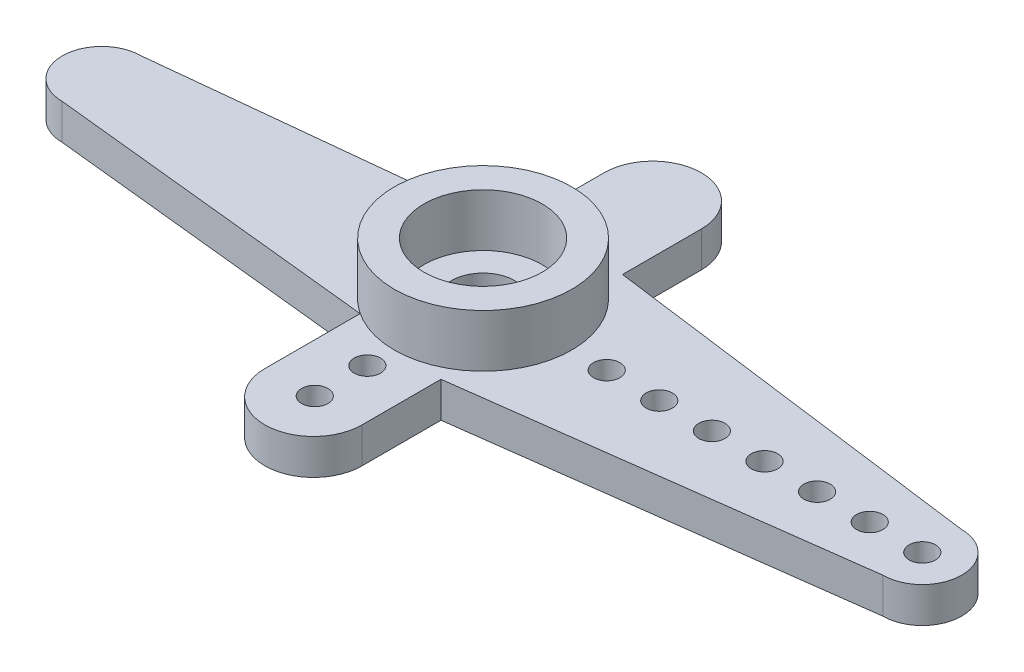
ISO-10303-21;
HEADER;
FILE_DESCRIPTION(('STEP AP214'),'2;1');
FILE_NAME('part.step','',(''),(''),'','','');
FILE_SCHEMA(('AUTOMOTIVE_DESIGN { 1 0 10303 214 1 1 1 1 }'));
ENDSEC;
DATA;
#1=APPLICATION_CONTEXT('core data for automotive mechanical design processes');
#2=APPLICATION_PROTOCOL_DEFINITION('international standard','automotive_design',2000,#1);
#3=PRODUCT_CONTEXT('',#1,'mechanical');
#4=PRODUCT('Part','Part','',(#3));
#5=PRODUCT_RELATED_PRODUCT_CATEGORY('part','',(#4));
#6=PRODUCT_DEFINITION_FORMATION('','',#4);
#7=PRODUCT_DEFINITION_CONTEXT('part definition',#1,'design');
#8=PRODUCT_DEFINITION('design','',#6,#7);
#9=PRODUCT_DEFINITION_SHAPE('','',#8);
#10=(LENGTH_UNIT() NAMED_UNIT(*) SI_UNIT(.MILLI.,.METRE.));
#11=(NAMED_UNIT(*) PLANE_ANGLE_UNIT() SI_UNIT($,.RADIAN.));
#12=(NAMED_UNIT(*) SI_UNIT($,.STERADIAN.) SOLID_ANGLE_UNIT());
#13=UNCERTAINTY_MEASURE_WITH_UNIT(LENGTH_MEASURE(1.E-05),#10,'distance_accuracy_value','');
#14=(GEOMETRIC_REPRESENTATION_CONTEXT(3) GLOBAL_UNCERTAINTY_ASSIGNED_CONTEXT((#13)) GLOBAL_UNIT_ASSIGNED_CONTEXT((#10,
#11,#12)) REPRESENTATION_CONTEXT('',''));
#15=CARTESIAN_POINT('',(0.,0.,0.));
#16=DIRECTION('',(0.,0.,1.));
#17=DIRECTION('',(1.,0.,0.));
#18=AXIS2_PLACEMENT_3D('',#15,#16,#17);
#19=CARTESIAN_POINT('',(-0.312640586171714,1.35,-2.98563064108722));
#20=DIRECTION('',(0.10414565677559,0.,0.994562055467018));
#21=DIRECTION('',(0.994562055467019,0.,-0.10414565677559));
#22=AXIS2_PLACEMENT_3D('',#19,#20,#21);
#23=PLANE('',#22);
#24=DIRECTION('',(-0.994562055467019,0.,0.10414565677559));
#25=VECTOR('',#24,1.);
#26=CARTESIAN_POINT('',(-0.312640586171714,0.,-2.98563064108722));
#27=LINE('',#26,#25);
#28=CARTESIAN_POINT('',(-1.85,0.,-2.82464590919123));
#29=VERTEX_POINT('',#28);
#30=CARTESIAN_POINT('',(-14.5,0.,-1.5));
#31=VERTEX_POINT('',#30);
#32=EDGE_CURVE('E301',#29,#31,#27,.T.);
#33=ORIENTED_EDGE('',*,*,#32,.T.);
#34=DIRECTION('',(0.,-1.,0.));
#35=VECTOR('',#34,1.);
#36=CARTESIAN_POINT('',(-14.5,1.35,-1.5));
#37=LINE('',#36,#35);
#38=CARTESIAN_POINT('',(-14.5,1.35,-1.5));
#39=VERTEX_POINT('',#38);
#40=EDGE_CURVE('E12',#39,#31,#37,.T.);
#41=ORIENTED_EDGE('',*,*,#40,.F.);
#42=DIRECTION('',(-0.994562055467019,0.,0.10414565677559));
#43=VECTOR('',#42,1.);
#44=CARTESIAN_POINT('',(-0.312640586171714,1.35,-2.98563064108722));
#45=LINE('',#44,#43);
#46=CARTESIAN_POINT('',(-1.85,1.35,-2.82464590919123));
#47=VERTEX_POINT('',#46);
#48=EDGE_CURVE('E317',#47,#39,#45,.T.);
#49=ORIENTED_EDGE('',*,*,#48,.F.);
#50=DIRECTION('',(0.,-1.,0.));
#51=VECTOR('',#50,1.);
#52=CARTESIAN_POINT('',(-1.85,1.35,-2.82464590919123));
#53=LINE('',#52,#51);
#54=EDGE_CURVE('E189',#47,#29,#53,.T.);
#55=ORIENTED_EDGE('',*,*,#54,.T.);
#56=EDGE_LOOP('',(#33,#41,#49,#55));
#57=FACE_BOUND('',#56,.T.);
#58=ADVANCED_FACE('F170',(#57),#23,.F.);
#59=CARTESIAN_POINT('',(-14.5,1.35,0.));
#60=DIRECTION('',(0.,-1.,0.));
#61=DIRECTION('',(0.,0.,-1.));
#62=AXIS2_PLACEMENT_3D('',#59,#60,#61);
#63=CYLINDRICAL_SURFACE('',#62,1.5);
#64=CARTESIAN_POINT('',(-14.5,0.,0.));
#65=DIRECTION('',(0.,1.,0.));
#66=DIRECTION('',(0.,0.,1.));
#67=AXIS2_PLACEMENT_3D('',#64,#65,#66);
#68=CIRCLE('',#67,1.5);
#69=CARTESIAN_POINT('',(-14.5,0.,1.5));
#70=VERTEX_POINT('',#69);
#71=EDGE_CURVE('E304',#31,#70,#68,.T.);
#72=ORIENTED_EDGE('',*,*,#71,.T.);
#73=DIRECTION('',(0.,-1.,0.));
#74=VECTOR('',#73,1.);
#75=CARTESIAN_POINT('',(-14.5,1.35,1.5));
#76=LINE('',#75,#74);
#77=CARTESIAN_POINT('',(-14.5,1.35,1.5));
#78=VERTEX_POINT('',#77);
#79=EDGE_CURVE('E180',#78,#70,#76,.T.);
#80=ORIENTED_EDGE('',*,*,#79,.F.);
#81=CARTESIAN_POINT('',(-14.5,1.35,0.));
#82=DIRECTION('',(0.,1.,0.));
#83=DIRECTION('',(0.,0.,1.));
#84=AXIS2_PLACEMENT_3D('',#81,#82,#83);
#85=CIRCLE('',#84,1.5);
#86=EDGE_CURVE('E382',#39,#78,#85,.T.);
#87=ORIENTED_EDGE('',*,*,#86,.F.);
#88=ORIENTED_EDGE('',*,*,#40,.T.);
#89=EDGE_LOOP('',(#72,#80,#87,#88));
#90=FACE_BOUND('',#89,.T.);
#91=ADVANCED_FACE('F380',(#90),#63,.T.);
#92=CARTESIAN_POINT('',(-0.312640586171714,1.35,2.98563064108722));
#93=DIRECTION('',(-0.10414565677559,0.,0.994562055467018));
#94=DIRECTION('',(0.994562055467019,0.,0.10414565677559));
#95=AXIS2_PLACEMENT_3D('',#92,#93,#94);
#96=PLANE('',#95);
#97=DIRECTION('',(-0.994562055467019,0.,-0.10414565677559));
#98=VECTOR('',#97,1.);
#99=CARTESIAN_POINT('',(-0.312640586171714,0.,2.98563064108722));
#100=LINE('',#99,#98);
#101=CARTESIAN_POINT('',(-1.85,0.,2.82464590919123));
#102=VERTEX_POINT('',#101);
#103=EDGE_CURVE('E309',#102,#70,#100,.T.);
#104=ORIENTED_EDGE('',*,*,#103,.F.);
#105=DIRECTION('',(0.,-1.,0.));
#106=VECTOR('',#105,1.);
#107=CARTESIAN_POINT('',(-1.85,1.35,2.82464590919123));
#108=LINE('',#107,#106);
#109=CARTESIAN_POINT('',(-1.85,1.35,2.82464590919123));
#110=VERTEX_POINT('',#109);
#111=EDGE_CURVE('E319',#110,#102,#108,.T.);
#112=ORIENTED_EDGE('',*,*,#111,.F.);
#113=DIRECTION('',(-0.994562055467019,0.,-0.10414565677559));
#114=VECTOR('',#113,1.);
#115=CARTESIAN_POINT('',(-0.312640586171714,1.35,2.98563064108722));
#116=LINE('',#115,#114);
#117=EDGE_CURVE('E312',#110,#78,#116,.T.);
#118=ORIENTED_EDGE('',*,*,#117,.T.);
#119=ORIENTED_EDGE('',*,*,#79,.T.);
#120=EDGE_LOOP('',(#104,#112,#118,#119));
#121=FACE_BOUND('',#120,.T.);
#122=ADVANCED_FACE('F376',(#121),#96,.T.);
#123=CARTESIAN_POINT('',(0.,1.35,0.));
#124=DIRECTION('',(0.,1.,0.));
#125=DIRECTION('',(0.,0.,1.));
#126=AXIS2_PLACEMENT_3D('',#123,#124,#125);
#127=PLANE('',#126);
#128=CARTESIAN_POINT('',(8.7,1.35,0.));
#129=DIRECTION('',(0.,1.,0.));
#130=DIRECTION('',(0.,0.,1.));
#131=AXIS2_PLACEMENT_3D('',#128,#129,#130);
#132=CIRCLE('',#131,0.500000000000001);
#133=CARTESIAN_POINT('',(8.7,1.35,0.500000000000001));
#134=VERTEX_POINT('',#133);
#135=EDGE_CURVE('E403',#134,#134,#132,.T.);
#136=ORIENTED_EDGE('',*,*,#135,.F.);
#137=EDGE_LOOP('',(#136));
#138=FACE_BOUND('',#137,.T.);
#139=CARTESIAN_POINT('',(10.7,1.35,0.));
#140=DIRECTION('',(0.,1.,0.));
#141=DIRECTION('',(0.,0.,1.));
#142=AXIS2_PLACEMENT_3D('',#139,#140,#141);
#143=CIRCLE('',#142,0.500000000000001);
#144=CARTESIAN_POINT('',(10.7,1.35,0.500000000000001));
#145=VERTEX_POINT('',#144);
#146=EDGE_CURVE('E408',#145,#145,#143,.T.);
#147=ORIENTED_EDGE('',*,*,#146,.F.);
#148=EDGE_LOOP('',(#147));
#149=FACE_BOUND('',#148,.T.);
#150=CARTESIAN_POINT('',(12.7,1.35,0.));
#151=DIRECTION('',(0.,1.,0.));
#152=DIRECTION('',(0.,0.,1.));
#153=AXIS2_PLACEMENT_3D('',#150,#151,#152);
#154=CIRCLE('',#153,0.500000000000001);
#155=CARTESIAN_POINT('',(12.7,1.35,0.500000000000001));
#156=VERTEX_POINT('',#155);
#157=EDGE_CURVE('E411',#156,#156,#154,.T.);
#158=ORIENTED_EDGE('',*,*,#157,.F.);
#159=EDGE_LOOP('',(#158));
#160=FACE_BOUND('',#159,.T.);
#161=CARTESIAN_POINT('',(14.7,1.35,0.));
#162=DIRECTION('',(0.,1.,0.));
#163=DIRECTION('',(0.,0.,1.));
#164=AXIS2_PLACEMENT_3D('',#161,#162,#163);
#165=CIRCLE('',#164,0.499999999999999);
#166=CARTESIAN_POINT('',(14.7,1.35,0.499999999999999));
#167=VERTEX_POINT('',#166);
#168=EDGE_CURVE('E414',#167,#167,#165,.T.);
#169=ORIENTED_EDGE('',*,*,#168,.F.);
#170=EDGE_LOOP('',(#169));
#171=FACE_BOUND('',#170,.T.);
#172=CARTESIAN_POINT('',(16.7,1.35,0.));
#173=DIRECTION('',(0.,1.,0.));
#174=DIRECTION('',(0.,0.,1.));
#175=AXIS2_PLACEMENT_3D('',#172,#173,#174);
#176=CIRCLE('',#175,0.499999999999999);
#177=CARTESIAN_POINT('',(16.7,1.35,0.499999999999999));
#178=VERTEX_POINT('',#177);
#179=EDGE_CURVE('E417',#178,#178,#176,.T.);
#180=ORIENTED_EDGE('',*,*,#179,.F.);
#181=EDGE_LOOP('',(#180));
#182=FACE_BOUND('',#181,.T.);
#183=CARTESIAN_POINT('',(6.7,1.35,0.));
#184=DIRECTION('',(0.,1.,0.));
#185=DIRECTION('',(0.,0.,1.));
#186=AXIS2_PLACEMENT_3D('',#183,#184,#185);
#187=CIRCLE('',#186,0.500000000000001);
#188=CARTESIAN_POINT('',(6.7,1.35,0.500000000000001));
#189=VERTEX_POINT('',#188);
#190=EDGE_CURVE('E420',#189,#189,#187,.T.);
#191=ORIENTED_EDGE('',*,*,#190,.F.);
#192=EDGE_LOOP('',(#191));
#193=FACE_BOUND('',#192,.T.);
#194=CARTESIAN_POINT('',(0.,1.35,6.4));
#195=DIRECTION('',(0.,1.,0.));
#196=DIRECTION('',(0.,0.,1.));
#197=AXIS2_PLACEMENT_3D('',#194,#195,#196);
#198=CIRCLE('',#197,0.5);
#199=CARTESIAN_POINT('',(0.,1.35,6.9));
#200=VERTEX_POINT('',#199);
#201=EDGE_CURVE('E423',#200,#200,#198,.T.);
#202=ORIENTED_EDGE('',*,*,#201,.F.);
#203=EDGE_LOOP('',(#202));
#204=FACE_BOUND('',#203,.T.);
#205=CARTESIAN_POINT('',(0.,1.35,4.4));
#206=DIRECTION('',(0.,1.,0.));
#207=DIRECTION('',(0.,0.,1.));
#208=AXIS2_PLACEMENT_3D('',#205,#206,#207);
#209=CIRCLE('',#208,0.5);
#210=CARTESIAN_POINT('',(0.,1.35,4.9));
#211=VERTEX_POINT('',#210);
#212=EDGE_CURVE('E426',#211,#211,#209,.T.);
#213=ORIENTED_EDGE('',*,*,#212,.F.);
#214=EDGE_LOOP('',(#213));
#215=FACE_BOUND('',#214,.T.);
#216=CARTESIAN_POINT('',(4.7,1.35,0.));
#217=DIRECTION('',(0.,1.,0.));
#218=DIRECTION('',(0.,0.,1.));
#219=AXIS2_PLACEMENT_3D('',#216,#217,#218);
#220=CIRCLE('',#219,0.500000000000002);
#221=CARTESIAN_POINT('',(4.7,1.35,0.500000000000002));
#222=VERTEX_POINT('',#221);
#223=EDGE_CURVE('E429',#222,#222,#220,.T.);
#224=ORIENTED_EDGE('',*,*,#223,.F.);
#225=EDGE_LOOP('',(#224));
#226=FACE_BOUND('',#225,.T.);
#227=CARTESIAN_POINT('',(0.,1.35,0.));
#228=DIRECTION('',(0.,1.,0.));
#229=DIRECTION('',(0.,0.,1.));
#230=AXIS2_PLACEMENT_3D('',#227,#228,#229);
#231=CIRCLE('',#230,3.375);
#232=CARTESIAN_POINT('',(0.,1.35,3.375));
#233=VERTEX_POINT('',#232);
#234=EDGE_CURVE('E388',#233,#233,#231,.T.);
#235=ORIENTED_EDGE('',*,*,#234,.F.);
#236=EDGE_LOOP('',(#235));
#237=FACE_BOUND('',#236,.T.);
#238=DIRECTION('',(0.,0.,-1.));
#239=VECTOR('',#238,1.);
#240=CARTESIAN_POINT('',(-1.85,1.35,0.));
#241=LINE('',#240,#239);
#242=CARTESIAN_POINT('',(-1.85,1.35,-6.45));
#243=VERTEX_POINT('',#242);
#244=EDGE_CURVE('E323',#47,#243,#241,.T.);
#245=ORIENTED_EDGE('',*,*,#244,.F.);
#246=ORIENTED_EDGE('',*,*,#48,.T.);
#247=ORIENTED_EDGE('',*,*,#86,.T.);
#248=ORIENTED_EDGE('',*,*,#117,.F.);
#249=DIRECTION('',(0.,0.,-1.));
#250=VECTOR('',#249,1.);
#251=CARTESIAN_POINT('',(-1.85,1.35,0.));
#252=LINE('',#251,#250);
#253=CARTESIAN_POINT('',(-1.85,1.35,6.45));
#254=VERTEX_POINT('',#253);
#255=EDGE_CURVE('E325',#254,#110,#252,.T.);
#256=ORIENTED_EDGE('',*,*,#255,.F.);
#257=CARTESIAN_POINT('',(0.,1.35,6.45));
#258=DIRECTION('',(0.,1.,0.));
#259=DIRECTION('',(0.,0.,1.));
#260=AXIS2_PLACEMENT_3D('',#257,#258,#259);
#261=CIRCLE('',#260,1.85);
#262=CARTESIAN_POINT('',(1.85,1.35,6.45));
#263=VERTEX_POINT('',#262);
#264=EDGE_CURVE('E328',#254,#263,#261,.T.);
#265=ORIENTED_EDGE('',*,*,#264,.T.);
#266=DIRECTION('',(0.,0.,-1.));
#267=VECTOR('',#266,1.);
#268=CARTESIAN_POINT('',(1.85,1.35,0.));
#269=LINE('',#268,#267);
#270=CARTESIAN_POINT('',(1.85,1.35,3.45));
#271=VERTEX_POINT('',#270);
#272=EDGE_CURVE('E330',#263,#271,#269,.T.);
#273=ORIENTED_EDGE('',*,*,#272,.T.);
#274=DIRECTION('',(0.991488349625111,0.,-0.130195439849762));
#275=VECTOR('',#274,1.);
#276=CARTESIAN_POINT('',(0.476710130391174,1.35,3.63033099297894));
#277=LINE('',#276,#275);
#278=CARTESIAN_POINT('',(16.7,1.35,1.5));
#279=VERTEX_POINT('',#278);
#280=EDGE_CURVE('E333',#271,#279,#277,.T.);
#281=ORIENTED_EDGE('',*,*,#280,.T.);
#282=CARTESIAN_POINT('',(16.7,1.35,0.));
#283=DIRECTION('',(0.,1.,0.));
#284=DIRECTION('',(0.,0.,1.));
#285=AXIS2_PLACEMENT_3D('',#282,#283,#284);
#286=CIRCLE('',#285,1.5);
#287=CARTESIAN_POINT('',(16.7,1.35,-1.5));
#288=VERTEX_POINT('',#287);
#289=EDGE_CURVE('E335',#288,#279,#286,.F.);
#290=ORIENTED_EDGE('',*,*,#289,.F.);
#291=DIRECTION('',(0.991488349625111,0.,0.130195439849762));
#292=VECTOR('',#291,1.);
#293=CARTESIAN_POINT('',(0.476710130391174,1.35,-3.63033099297894));
#294=LINE('',#293,#292);
#295=CARTESIAN_POINT('',(1.85,1.35,-3.45));
#296=VERTEX_POINT('',#295);
#297=EDGE_CURVE('E267',#296,#288,#294,.T.);
#298=ORIENTED_EDGE('',*,*,#297,.F.);
#299=DIRECTION('',(0.,0.,-1.));
#300=VECTOR('',#299,1.);
#301=CARTESIAN_POINT('',(1.85,1.35,0.));
#302=LINE('',#301,#300);
#303=CARTESIAN_POINT('',(1.85,1.35,-6.45));
#304=VERTEX_POINT('',#303);
#305=EDGE_CURVE('E265',#296,#304,#302,.T.);
#306=ORIENTED_EDGE('',*,*,#305,.T.);
#307=CARTESIAN_POINT('',(0.,1.35,-6.45));
#308=DIRECTION('',(0.,1.,0.));
#309=DIRECTION('',(0.,0.,1.));
#310=AXIS2_PLACEMENT_3D('',#307,#308,#309);
#311=CIRCLE('',#310,1.85);
#312=EDGE_CURVE('E284',#304,#243,#311,.T.);
#313=ORIENTED_EDGE('',*,*,#312,.T.);
#314=EDGE_LOOP('',(#245,#246,#247,#248,#256,#265,#273,#281,#290,#298,#306,#313));
#315=FACE_BOUND('',#314,.T.);
#316=ADVANCED_FACE('F360',(#138,#149,#160,#171,#182,#193,#204,#215,#226,#237,#315),#127,.T.);
#317=CARTESIAN_POINT('',(0.,0.,0.));
#318=DIRECTION('',(0.,1.,0.));
#319=DIRECTION('',(0.,0.,1.));
#320=AXIS2_PLACEMENT_3D('',#317,#318,#319);
#321=PLANE('',#320);
#322=CARTESIAN_POINT('',(8.7,0.,0.));
#323=DIRECTION('',(0.,-1.,0.));
#324=DIRECTION('',(0.,0.,-1.));
#325=AXIS2_PLACEMENT_3D('',#322,#323,#324);
#326=CIRCLE('',#325,0.500000000000001);
#327=CARTESIAN_POINT('',(8.7,0.,-0.500000000000001));
#328=VERTEX_POINT('',#327);
#329=EDGE_CURVE('E435',#328,#328,#326,.T.);
#330=ORIENTED_EDGE('',*,*,#329,.F.);
#331=EDGE_LOOP('',(#330));
#332=FACE_BOUND('',#331,.T.);
#333=CARTESIAN_POINT('',(10.7,0.,0.));
#334=DIRECTION('',(0.,-1.,0.));
#335=DIRECTION('',(0.,0.,-1.));
#336=AXIS2_PLACEMENT_3D('',#333,#334,#335);
#337=CIRCLE('',#336,0.500000000000001);
#338=CARTESIAN_POINT('',(10.7,0.,-0.500000000000001));
#339=VERTEX_POINT('',#338);
#340=EDGE_CURVE('E443',#339,#339,#337,.T.);
#341=ORIENTED_EDGE('',*,*,#340,.F.);
#342=EDGE_LOOP('',(#341));
#343=FACE_BOUND('',#342,.T.);
#344=CARTESIAN_POINT('',(12.7,0.,0.));
#345=DIRECTION('',(0.,-1.,0.));
#346=DIRECTION('',(0.,0.,-1.));
#347=AXIS2_PLACEMENT_3D('',#344,#345,#346);
#348=CIRCLE('',#347,0.500000000000001);
#349=CARTESIAN_POINT('',(12.7,0.,-0.500000000000001));
#350=VERTEX_POINT('',#349);
#351=EDGE_CURVE('E439',#350,#350,#348,.T.);
#352=ORIENTED_EDGE('',*,*,#351,.F.);
#353=EDGE_LOOP('',(#352));
#354=FACE_BOUND('',#353,.T.);
#355=CARTESIAN_POINT('',(14.7,0.,0.));
#356=DIRECTION('',(0.,-1.,0.));
#357=DIRECTION('',(0.,0.,-1.));
#358=AXIS2_PLACEMENT_3D('',#355,#356,#357);
#359=CIRCLE('',#358,0.499999999999999);
#360=CARTESIAN_POINT('',(14.7,0.,-0.499999999999999));
#361=VERTEX_POINT('',#360);
#362=EDGE_CURVE('E436',#361,#361,#359,.T.);
#363=ORIENTED_EDGE('',*,*,#362,.F.);
#364=EDGE_LOOP('',(#363));
#365=FACE_BOUND('',#364,.T.);
#366=CARTESIAN_POINT('',(16.7,0.,0.));
#367=DIRECTION('',(0.,-1.,0.));
#368=DIRECTION('',(0.,0.,-1.));
#369=AXIS2_PLACEMENT_3D('',#366,#367,#368);
#370=CIRCLE('',#369,0.499999999999999);
#371=CARTESIAN_POINT('',(16.7,0.,-0.499999999999999));
#372=VERTEX_POINT('',#371);
#373=EDGE_CURVE('E440',#372,#372,#370,.T.);
#374=ORIENTED_EDGE('',*,*,#373,.F.);
#375=EDGE_LOOP('',(#374));
#376=FACE_BOUND('',#375,.T.);
#377=CARTESIAN_POINT('',(6.7,0.,0.));
#378=DIRECTION('',(0.,-1.,0.));
#379=DIRECTION('',(0.,0.,-1.));
#380=AXIS2_PLACEMENT_3D('',#377,#378,#379);
#381=CIRCLE('',#380,0.500000000000001);
#382=CARTESIAN_POINT('',(6.7,0.,-0.500000000000001));
#383=VERTEX_POINT('',#382);
#384=EDGE_CURVE('E454',#383,#383,#381,.T.);
#385=ORIENTED_EDGE('',*,*,#384,.F.);
#386=EDGE_LOOP('',(#385));
#387=FACE_BOUND('',#386,.T.);
#388=CARTESIAN_POINT('',(0.,0.,6.4));
#389=DIRECTION('',(0.,-1.,0.));
#390=DIRECTION('',(0.,0.,-1.));
#391=AXIS2_PLACEMENT_3D('',#388,#389,#390);
#392=CIRCLE('',#391,0.5);
#393=CARTESIAN_POINT('',(0.,0.,5.9));
#394=VERTEX_POINT('',#393);
#395=EDGE_CURVE('E451',#394,#394,#392,.T.);
#396=ORIENTED_EDGE('',*,*,#395,.F.);
#397=EDGE_LOOP('',(#396));
#398=FACE_BOUND('',#397,.T.);
#399=CARTESIAN_POINT('',(0.,0.,4.4));
#400=DIRECTION('',(0.,-1.,0.));
#401=DIRECTION('',(0.,0.,-1.));
#402=AXIS2_PLACEMENT_3D('',#399,#400,#401);
#403=CIRCLE('',#402,0.5);
#404=CARTESIAN_POINT('',(0.,0.,3.9));
#405=VERTEX_POINT('',#404);
#406=EDGE_CURVE('E448',#405,#405,#403,.T.);
#407=ORIENTED_EDGE('',*,*,#406,.F.);
#408=EDGE_LOOP('',(#407));
#409=FACE_BOUND('',#408,.T.);
#410=CARTESIAN_POINT('',(4.7,0.,0.));
#411=DIRECTION('',(0.,-1.,0.));
#412=DIRECTION('',(0.,0.,-1.));
#413=AXIS2_PLACEMENT_3D('',#410,#411,#412);
#414=CIRCLE('',#413,0.500000000000002);
#415=CARTESIAN_POINT('',(4.7,0.,-0.500000000000002));
#416=VERTEX_POINT('',#415);
#417=EDGE_CURVE('E432',#416,#416,#414,.T.);
#418=ORIENTED_EDGE('',*,*,#417,.F.);
#419=EDGE_LOOP('',(#418));
#420=FACE_BOUND('',#419,.T.);
#421=CARTESIAN_POINT('',(0.,0.,0.));
#422=DIRECTION('',(0.,1.,0.));
#423=DIRECTION('',(0.,0.,1.));
#424=AXIS2_PLACEMENT_3D('',#421,#422,#423);
#425=CIRCLE('',#424,1.2);
#426=CARTESIAN_POINT('',(0.,0.,1.2));
#427=VERTEX_POINT('',#426);
#428=EDGE_CURVE('E397',#427,#427,#425,.T.);
#429=ORIENTED_EDGE('',*,*,#428,.T.);
#430=EDGE_LOOP('',(#429));
#431=FACE_BOUND('',#430,.T.);
#432=ORIENTED_EDGE('',*,*,#32,.F.);
#433=DIRECTION('',(0.,0.,-1.));
#434=VECTOR('',#433,1.);
#435=CARTESIAN_POINT('',(-1.85,0.,0.));
#436=LINE('',#435,#434);
#437=CARTESIAN_POINT('',(-1.85,0.,-6.45));
#438=VERTEX_POINT('',#437);
#439=EDGE_CURVE('E340',#29,#438,#436,.T.);
#440=ORIENTED_EDGE('',*,*,#439,.T.);
#441=CARTESIAN_POINT('',(0.,0.,-6.45));
#442=DIRECTION('',(0.,1.,0.));
#443=DIRECTION('',(0.,0.,1.));
#444=AXIS2_PLACEMENT_3D('',#441,#442,#443);
#445=CIRCLE('',#444,1.85);
#446=CARTESIAN_POINT('',(1.85,0.,-6.45));
#447=VERTEX_POINT('',#446);
#448=EDGE_CURVE('E277',#447,#438,#445,.T.);
#449=ORIENTED_EDGE('',*,*,#448,.F.);
#450=DIRECTION('',(0.,0.,-1.));
#451=VECTOR('',#450,1.);
#452=CARTESIAN_POINT('',(1.85,0.,0.));
#453=LINE('',#452,#451);
#454=CARTESIAN_POINT('',(1.85,0.,-3.45));
#455=VERTEX_POINT('',#454);
#456=EDGE_CURVE('E263',#455,#447,#453,.T.);
#457=ORIENTED_EDGE('',*,*,#456,.F.);
#458=DIRECTION('',(0.991488349625111,0.,0.130195439849762));
#459=VECTOR('',#458,1.);
#460=CARTESIAN_POINT('',(0.476710130391174,0.,-3.63033099297894));
#461=LINE('',#460,#459);
#462=CARTESIAN_POINT('',(16.7,0.,-1.5));
#463=VERTEX_POINT('',#462);
#464=EDGE_CURVE('E274',#455,#463,#461,.T.);
#465=ORIENTED_EDGE('',*,*,#464,.T.);
#466=CARTESIAN_POINT('',(16.7,0.,0.));
#467=DIRECTION('',(0.,1.,0.));
#468=DIRECTION('',(0.,0.,1.));
#469=AXIS2_PLACEMENT_3D('',#466,#467,#468);
#470=CIRCLE('',#469,1.5);
#471=CARTESIAN_POINT('',(16.7,0.,1.5));
#472=VERTEX_POINT('',#471);
#473=EDGE_CURVE('E282',#463,#472,#470,.F.);
#474=ORIENTED_EDGE('',*,*,#473,.T.);
#475=DIRECTION('',(0.991488349625111,0.,-0.130195439849762));
#476=VECTOR('',#475,1.);
#477=CARTESIAN_POINT('',(0.476710130391174,0.,3.63033099297894));
#478=LINE('',#477,#476);
#479=CARTESIAN_POINT('',(1.85,0.,3.45));
#480=VERTEX_POINT('',#479);
#481=EDGE_CURVE('E286',#480,#472,#478,.T.);
#482=ORIENTED_EDGE('',*,*,#481,.F.);
#483=DIRECTION('',(0.,0.,-1.));
#484=VECTOR('',#483,1.);
#485=CARTESIAN_POINT('',(1.85,0.,0.));
#486=LINE('',#485,#484);
#487=CARTESIAN_POINT('',(1.85,0.,6.45));
#488=VERTEX_POINT('',#487);
#489=EDGE_CURVE('E347',#488,#480,#486,.T.);
#490=ORIENTED_EDGE('',*,*,#489,.F.);
#491=CARTESIAN_POINT('',(0.,0.,6.45));
#492=DIRECTION('',(0.,1.,0.));
#493=DIRECTION('',(0.,0.,1.));
#494=AXIS2_PLACEMENT_3D('',#491,#492,#493);
#495=CIRCLE('',#494,1.85);
#496=CARTESIAN_POINT('',(-1.85,0.,6.45));
#497=VERTEX_POINT('',#496);
#498=EDGE_CURVE('E345',#497,#488,#495,.T.);
#499=ORIENTED_EDGE('',*,*,#498,.F.);
#500=DIRECTION('',(0.,0.,-1.));
#501=VECTOR('',#500,1.);
#502=CARTESIAN_POINT('',(-1.85,0.,0.));
#503=LINE('',#502,#501);
#504=EDGE_CURVE('E342',#497,#102,#503,.T.);
#505=ORIENTED_EDGE('',*,*,#504,.T.);
#506=ORIENTED_EDGE('',*,*,#103,.T.);
#507=ORIENTED_EDGE('',*,*,#71,.F.);
#508=EDGE_LOOP('',(#432,#440,#449,#457,#465,#474,#482,#490,#499,#505,#506,#507));
#509=FACE_BOUND('',#508,.T.);
#510=ADVANCED_FACE('F272',(#332,#343,#354,#365,#376,#387,#398,#409,#420,#431,#509),#321,.F.);
#511=CARTESIAN_POINT('',(0.476710130391174,1.35,3.63033099297894));
#512=DIRECTION('',(-0.130195439849762,0.,-0.991488349625111));
#513=DIRECTION('',(-0.991488349625111,0.,0.130195439849762));
#514=AXIS2_PLACEMENT_3D('',#511,#512,#513);
#515=PLANE('',#514);
#516=ORIENTED_EDGE('',*,*,#481,.T.);
#517=DIRECTION('',(0.,-1.,0.));
#518=VECTOR('',#517,1.);
#519=CARTESIAN_POINT('',(16.7,1.35,1.5));
#520=LINE('',#519,#518);
#521=EDGE_CURVE('E291',#279,#472,#520,.T.);
#522=ORIENTED_EDGE('',*,*,#521,.F.);
#523=ORIENTED_EDGE('',*,*,#280,.F.);
#524=DIRECTION('',(0.,-1.,0.));
#525=VECTOR('',#524,1.);
#526=CARTESIAN_POINT('',(1.85,1.35,3.45));
#527=LINE('',#526,#525);
#528=EDGE_CURVE('E293',#271,#480,#527,.T.);
#529=ORIENTED_EDGE('',*,*,#528,.T.);
#530=EDGE_LOOP('',(#516,#522,#523,#529));
#531=FACE_BOUND('',#530,.T.);
#532=ADVANCED_FACE('F353',(#531),#515,.F.);
#533=CARTESIAN_POINT('',(16.7,1.35,0.));
#534=DIRECTION('',(0.,-1.,0.));
#535=DIRECTION('',(0.,0.,-1.));
#536=AXIS2_PLACEMENT_3D('',#533,#534,#535);
#537=CYLINDRICAL_SURFACE('',#536,1.5);
#538=ORIENTED_EDGE('',*,*,#473,.F.);
#539=DIRECTION('',(0.,-1.,0.));
#540=VECTOR('',#539,1.);
#541=CARTESIAN_POINT('',(16.7,1.35,-1.5));
#542=LINE('',#541,#540);
#543=EDGE_CURVE('E254',#288,#463,#542,.T.);
#544=ORIENTED_EDGE('',*,*,#543,.F.);
#545=ORIENTED_EDGE('',*,*,#289,.T.);
#546=ORIENTED_EDGE('',*,*,#521,.T.);
#547=EDGE_LOOP('',(#538,#544,#545,#546));
#548=FACE_BOUND('',#547,.T.);
#549=ADVANCED_FACE('F357',(#548),#537,.T.);
#550=CARTESIAN_POINT('',(0.476710130391174,1.35,-3.63033099297894));
#551=DIRECTION('',(0.130195439849762,0.,-0.991488349625111));
#552=DIRECTION('',(-0.991488349625111,0.,-0.130195439849762));
#553=AXIS2_PLACEMENT_3D('',#550,#551,#552);
#554=PLANE('',#553);
#555=ORIENTED_EDGE('',*,*,#464,.F.);
#556=DIRECTION('',(0.,-1.,0.));
#557=VECTOR('',#556,1.);
#558=CARTESIAN_POINT('',(1.85,1.35,-3.45));
#559=LINE('',#558,#557);
#560=EDGE_CURVE('E260',#296,#455,#559,.T.);
#561=ORIENTED_EDGE('',*,*,#560,.F.);
#562=ORIENTED_EDGE('',*,*,#297,.T.);
#563=ORIENTED_EDGE('',*,*,#543,.T.);
#564=EDGE_LOOP('',(#555,#561,#562,#563));
#565=FACE_BOUND('',#564,.T.);
#566=ADVANCED_FACE('F281',(#565),#554,.T.);
#567=CARTESIAN_POINT('',(1.85,1.35,0.));
#568=DIRECTION('',(-1.,0.,0.));
#569=DIRECTION('',(0.,0.,1.));
#570=AXIS2_PLACEMENT_3D('',#567,#568,#569);
#571=PLANE('',#570);
#572=ORIENTED_EDGE('',*,*,#456,.T.);
#573=DIRECTION('',(0.,-1.,0.));
#574=VECTOR('',#573,1.);
#575=CARTESIAN_POINT('',(1.85,1.35,-6.45));
#576=LINE('',#575,#574);
#577=EDGE_CURVE('E174',#304,#447,#576,.T.);
#578=ORIENTED_EDGE('',*,*,#577,.F.);
#579=ORIENTED_EDGE('',*,*,#305,.F.);
#580=ORIENTED_EDGE('',*,*,#560,.T.);
#581=EDGE_LOOP('',(#572,#578,#579,#580));
#582=FACE_BOUND('',#581,.T.);
#583=ADVANCED_FACE('F172',(#582),#571,.F.);
#584=CARTESIAN_POINT('',(1.85,1.35,0.));
#585=DIRECTION('',(-1.,0.,0.));
#586=DIRECTION('',(0.,0.,1.));
#587=AXIS2_PLACEMENT_3D('',#584,#585,#586);
#588=PLANE('',#587);
#589=ORIENTED_EDGE('',*,*,#489,.T.);
#590=ORIENTED_EDGE('',*,*,#528,.F.);
#591=ORIENTED_EDGE('',*,*,#272,.F.);
#592=DIRECTION('',(0.,-1.,0.));
#593=VECTOR('',#592,1.);
#594=CARTESIAN_POINT('',(1.85,1.35,6.45));
#595=LINE('',#594,#593);
#596=EDGE_CURVE('E295',#263,#488,#595,.T.);
#597=ORIENTED_EDGE('',*,*,#596,.T.);
#598=EDGE_LOOP('',(#589,#590,#591,#597));
#599=FACE_BOUND('',#598,.T.);
#600=ADVANCED_FACE('F366',(#599),#588,.F.);
#601=CARTESIAN_POINT('',(0.,1.35,-6.45));
#602=DIRECTION('',(0.,-1.,0.));
#603=DIRECTION('',(0.,0.,-1.));
#604=AXIS2_PLACEMENT_3D('',#601,#602,#603);
#605=CYLINDRICAL_SURFACE('',#604,1.85);
#606=ORIENTED_EDGE('',*,*,#448,.T.);
#607=DIRECTION('',(0.,-1.,0.));
#608=VECTOR('',#607,1.);
#609=CARTESIAN_POINT('',(-1.85,1.35,-6.45));
#610=LINE('',#609,#608);
#611=EDGE_CURVE('E299',#243,#438,#610,.T.);
#612=ORIENTED_EDGE('',*,*,#611,.F.);
#613=ORIENTED_EDGE('',*,*,#312,.F.);
#614=ORIENTED_EDGE('',*,*,#577,.T.);
#615=EDGE_LOOP('',(#606,#612,#613,#614));
#616=FACE_BOUND('',#615,.T.);
#617=ADVANCED_FACE('F519',(#616),#605,.T.);
#618=CARTESIAN_POINT('',(0.,1.35,6.45));
#619=DIRECTION('',(0.,-1.,0.));
#620=DIRECTION('',(0.,0.,-1.));
#621=AXIS2_PLACEMENT_3D('',#618,#619,#620);
#622=CYLINDRICAL_SURFACE('',#621,1.85);
#623=ORIENTED_EDGE('',*,*,#498,.T.);
#624=ORIENTED_EDGE('',*,*,#596,.F.);
#625=ORIENTED_EDGE('',*,*,#264,.F.);
#626=DIRECTION('',(0.,-1.,0.));
#627=VECTOR('',#626,1.);
#628=CARTESIAN_POINT('',(-1.85,1.35,6.45));
#629=LINE('',#628,#627);
#630=EDGE_CURVE('E298',#254,#497,#629,.T.);
#631=ORIENTED_EDGE('',*,*,#630,.T.);
#632=EDGE_LOOP('',(#623,#624,#625,#631));
#633=FACE_BOUND('',#632,.T.);
#634=ADVANCED_FACE('F523',(#633),#622,.T.);
#635=CARTESIAN_POINT('',(-1.85,1.35,0.));
#636=DIRECTION('',(-1.,0.,0.));
#637=DIRECTION('',(0.,0.,1.));
#638=AXIS2_PLACEMENT_3D('',#635,#636,#637);
#639=PLANE('',#638);
#640=ORIENTED_EDGE('',*,*,#504,.F.);
#641=ORIENTED_EDGE('',*,*,#630,.F.);
#642=ORIENTED_EDGE('',*,*,#255,.T.);
#643=ORIENTED_EDGE('',*,*,#111,.T.);
#644=EDGE_LOOP('',(#640,#641,#642,#643));
#645=FACE_BOUND('',#644,.T.);
#646=ADVANCED_FACE('F372',(#645),#639,.T.);
#647=CARTESIAN_POINT('',(-1.85,1.35,0.));
#648=DIRECTION('',(-1.,0.,0.));
#649=DIRECTION('',(0.,0.,1.));
#650=AXIS2_PLACEMENT_3D('',#647,#648,#649);
#651=PLANE('',#650);
#652=ORIENTED_EDGE('',*,*,#439,.F.);
#653=ORIENTED_EDGE('',*,*,#54,.F.);
#654=ORIENTED_EDGE('',*,*,#244,.T.);
#655=ORIENTED_EDGE('',*,*,#611,.T.);
#656=EDGE_LOOP('',(#652,#653,#654,#655));
#657=FACE_BOUND('',#656,.T.);
#658=ADVANCED_FACE('F504',(#657),#651,.T.);
#659=CARTESIAN_POINT('',(0.,3.35,0.));
#660=DIRECTION('',(0.,-1.,0.));
#661=DIRECTION('',(0.,0.,-1.));
#662=AXIS2_PLACEMENT_3D('',#659,#660,#661);
#663=CYLINDRICAL_SURFACE('',#662,3.375);
#664=CARTESIAN_POINT('',(0.,3.35,0.));
#665=DIRECTION('',(0.,1.,0.));
#666=DIRECTION('',(0.,0.,1.));
#667=AXIS2_PLACEMENT_3D('',#664,#665,#666);
#668=CIRCLE('',#667,3.375);
#669=CARTESIAN_POINT('',(0.,3.35,3.375));
#670=VERTEX_POINT('',#669);
#671=EDGE_CURVE('E279',#670,#670,#668,.T.);
#672=ORIENTED_EDGE('',*,*,#671,.F.);
#673=EDGE_LOOP('',(#672));
#674=FACE_BOUND('',#673,.T.);
#675=ORIENTED_EDGE('',*,*,#234,.T.);
#676=EDGE_LOOP('',(#675));
#677=FACE_BOUND('',#676,.T.);
#678=ADVANCED_FACE('F466',(#674,#677),#663,.T.);
#679=CARTESIAN_POINT('',(0.,3.35,0.));
#680=DIRECTION('',(0.,1.,0.));
#681=DIRECTION('',(0.,0.,1.));
#682=AXIS2_PLACEMENT_3D('',#679,#680,#681);
#683=PLANE('',#682);
#684=CARTESIAN_POINT('',(0.,3.35,0.));
#685=DIRECTION('',(0.,1.,0.));
#686=DIRECTION('',(0.,0.,1.));
#687=AXIS2_PLACEMENT_3D('',#684,#685,#686);
#688=CIRCLE('',#687,2.25);
#689=CARTESIAN_POINT('',(0.,3.35,2.25));
#690=VERTEX_POINT('',#689);
#691=EDGE_CURVE('E394',#690,#690,#688,.T.);
#692=ORIENTED_EDGE('',*,*,#691,.F.);
#693=EDGE_LOOP('',(#692));
#694=FACE_BOUND('',#693,.T.);
#695=ORIENTED_EDGE('',*,*,#671,.T.);
#696=EDGE_LOOP('',(#695));
#697=FACE_BOUND('',#696,.T.);
#698=ADVANCED_FACE('F493',(#694,#697),#683,.T.);
#699=CARTESIAN_POINT('',(0.,1.35,0.));
#700=DIRECTION('',(0.,1.,0.));
#701=DIRECTION('',(0.,0.,1.));
#702=AXIS2_PLACEMENT_3D('',#699,#700,#701);
#703=CYLINDRICAL_SURFACE('',#702,2.25);
#704=CARTESIAN_POINT('',(0.,1.35,0.));
#705=DIRECTION('',(0.,1.,0.));
#706=DIRECTION('',(0.,0.,1.));
#707=AXIS2_PLACEMENT_3D('',#704,#705,#706);
#708=CIRCLE('',#707,2.25);
#709=CARTESIAN_POINT('',(0.,1.35,2.25));
#710=VERTEX_POINT('',#709);
#711=EDGE_CURVE('E391',#710,#710,#708,.T.);
#712=ORIENTED_EDGE('',*,*,#711,.F.);
#713=EDGE_LOOP('',(#712));
#714=FACE_BOUND('',#713,.T.);
#715=ORIENTED_EDGE('',*,*,#691,.T.);
#716=EDGE_LOOP('',(#715));
#717=FACE_BOUND('',#716,.T.);
#718=ADVANCED_FACE('F487',(#714,#717),#703,.F.);
#719=CARTESIAN_POINT('',(0.,1.35,0.));
#720=DIRECTION('',(0.,1.,0.));
#721=DIRECTION('',(0.,0.,1.));
#722=AXIS2_PLACEMENT_3D('',#719,#720,#721);
#723=PLANE('',#722);
#724=CARTESIAN_POINT('',(0.,1.35,0.));
#725=DIRECTION('',(0.,1.,0.));
#726=DIRECTION('',(0.,0.,1.));
#727=AXIS2_PLACEMENT_3D('',#724,#725,#726);
#728=CIRCLE('',#727,1.2);
#729=CARTESIAN_POINT('',(0.,1.35,1.2));
#730=VERTEX_POINT('',#729);
#731=EDGE_CURVE('E400',#730,#730,#728,.T.);
#732=ORIENTED_EDGE('',*,*,#731,.F.);
#733=EDGE_LOOP('',(#732));
#734=FACE_BOUND('',#733,.T.);
#735=ORIENTED_EDGE('',*,*,#711,.T.);
#736=EDGE_LOOP('',(#735));
#737=FACE_BOUND('',#736,.T.);
#738=ADVANCED_FACE('F481',(#734,#737),#723,.T.);
#739=CARTESIAN_POINT('',(0.,0.,0.));
#740=DIRECTION('',(0.,1.,0.));
#741=DIRECTION('',(0.,0.,1.));
#742=AXIS2_PLACEMENT_3D('',#739,#740,#741);
#743=CYLINDRICAL_SURFACE('',#742,1.2);
#744=CARTESIAN_POINT('',(0.,0.,1.2));
#745=CARTESIAN_POINT('',(0.,0.0140625,1.2));
#746=CARTESIAN_POINT('',(0.,0.028125,1.2));
#747=CARTESIAN_POINT('',(0.,0.05625,1.2));
#748=CARTESIAN_POINT('',(0.,0.0703125,1.2));
#749=CARTESIAN_POINT('',(0.,0.0984375,1.2));
#750=CARTESIAN_POINT('',(0.,0.1125,1.2));
#751=CARTESIAN_POINT('',(0.,0.140625,1.2));
#752=CARTESIAN_POINT('',(0.,0.1546875,1.2));
#753=CARTESIAN_POINT('',(0.,0.1828125,1.2));
#754=CARTESIAN_POINT('',(0.,0.196875,1.2));
#755=CARTESIAN_POINT('',(0.,0.225,1.2));
#756=CARTESIAN_POINT('',(0.,0.2390625,1.2));
#757=CARTESIAN_POINT('',(0.,0.2671875,1.2));
#758=CARTESIAN_POINT('',(0.,0.28125,1.2));
#759=CARTESIAN_POINT('',(0.,0.309375,1.2));
#760=CARTESIAN_POINT('',(0.,0.3234375,1.2));
#761=CARTESIAN_POINT('',(0.,0.3515625,1.2));
#762=CARTESIAN_POINT('',(0.,0.365625,1.2));
#763=CARTESIAN_POINT('',(0.,0.39375,1.2));
#764=CARTESIAN_POINT('',(0.,0.4078125,1.2));
#765=CARTESIAN_POINT('',(0.,0.4359375,1.2));
#766=CARTESIAN_POINT('',(0.,0.45,1.2));
#767=CARTESIAN_POINT('',(0.,0.478125,1.2));
#768=CARTESIAN_POINT('',(0.,0.4921875,1.2));
#769=CARTESIAN_POINT('',(0.,0.5203125,1.2));
#770=CARTESIAN_POINT('',(0.,0.534375,1.2));
#771=CARTESIAN_POINT('',(0.,0.5625,1.2));
#772=CARTESIAN_POINT('',(0.,0.5765625,1.2));
#773=CARTESIAN_POINT('',(0.,0.6046875,1.2));
#774=CARTESIAN_POINT('',(0.,0.61875,1.2));
#775=CARTESIAN_POINT('',(0.,0.646875,1.2));
#776=CARTESIAN_POINT('',(0.,0.6609375,1.2));
#777=CARTESIAN_POINT('',(0.,0.6890625,1.2));
#778=CARTESIAN_POINT('',(0.,0.703125,1.2));
#779=CARTESIAN_POINT('',(0.,0.73125,1.2));
#780=CARTESIAN_POINT('',(0.,0.7453125,1.2));
#781=CARTESIAN_POINT('',(0.,0.7734375,1.2));
#782=CARTESIAN_POINT('',(0.,0.7875,1.2));
#783=CARTESIAN_POINT('',(0.,0.815625,1.2));
#784=CARTESIAN_POINT('',(0.,0.8296875,1.2));
#785=CARTESIAN_POINT('',(0.,0.8578125,1.2));
#786=CARTESIAN_POINT('',(0.,0.871875,1.2));
#787=CARTESIAN_POINT('',(0.,0.9,1.2));
#788=CARTESIAN_POINT('',(0.,0.9140625,1.2));
#789=CARTESIAN_POINT('',(0.,0.9421875,1.2));
#790=CARTESIAN_POINT('',(0.,0.95625,1.2));
#791=CARTESIAN_POINT('',(0.,0.984375,1.2));
#792=CARTESIAN_POINT('',(0.,0.9984375,1.2));
#793=CARTESIAN_POINT('',(0.,1.0265625,1.2));
#794=CARTESIAN_POINT('',(0.,1.040625,1.2));
#795=CARTESIAN_POINT('',(0.,1.06875,1.2));
#796=CARTESIAN_POINT('',(0.,1.0828125,1.2));
#797=CARTESIAN_POINT('',(0.,1.1109375,1.2));
#798=CARTESIAN_POINT('',(0.,1.125,1.2));
#799=CARTESIAN_POINT('',(0.,1.153125,1.2));
#800=CARTESIAN_POINT('',(0.,1.1671875,1.2));
#801=CARTESIAN_POINT('',(0.,1.1953125,1.2));
#802=CARTESIAN_POINT('',(0.,1.209375,1.2));
#803=CARTESIAN_POINT('',(0.,1.2375,1.2));
#804=CARTESIAN_POINT('',(0.,1.2515625,1.2));
#805=CARTESIAN_POINT('',(0.,1.2796875,1.2));
#806=CARTESIAN_POINT('',(0.,1.29375,1.2));
#807=CARTESIAN_POINT('',(0.,1.321875,1.2));
#808=CARTESIAN_POINT('',(0.,1.3359375,1.2));
#809=CARTESIAN_POINT('',(0.,1.35,1.2));
#810=B_SPLINE_CURVE_WITH_KNOTS('',3,(#744,#745,#746,#747,#748,#749,#750,#751,#752,#753,#754,
#755,#756,#757,#758,#759,#760,#761,#762,#763,#764,#765,#766,#767,#768,#769,#770,#771,#772,#773,
#774,#775,#776,#777,#778,#779,#780,#781,#782,#783,#784,#785,#786,#787,#788,#789,#790,#791,#792,
#793,#794,#795,#796,#797,#798,#799,#800,#801,#802,#803,#804,#805,#806,#807,#808,#809),
.UNSPECIFIED.,.F.,.F.,(4,2,2,2,2,2,2,2,2,2,2,2,2,2,2,2,2,2,2,2,2,2,2,2,2,2,2,2,2,2,2,2,4),(0.,
0.0421875,0.084375,0.1265625,0.16875,0.2109375,0.253125,0.2953125,0.3375,0.3796875,0.421875,
0.4640625,0.50625,0.5484375,0.590625,0.6328125,0.675,0.7171875,0.759375,0.8015625,0.84375,
0.8859375,0.928125,0.9703125,1.0125,1.0546875,1.096875,1.1390625,1.18125,1.2234375,1.265625,
1.3078125,1.35),.UNSPECIFIED.);
#811=EDGE_CURVE('BSEAM477',#427,#730,#810,.T.);
#812=ORIENTED_EDGE('',*,*,#428,.F.);
#813=ORIENTED_EDGE('',*,*,#731,.T.);
#814=ORIENTED_EDGE('',*,*,#811,.T.);
#815=ORIENTED_EDGE('',*,*,#811,.F.);
#816=EDGE_LOOP('',(#812,#814,#813,#815));
#817=FACE_BOUND('',#816,.T.);
#818=ADVANCED_FACE('F477',(#817),#743,.F.);
#819=CARTESIAN_POINT('',(4.7,3.35,0.));
#820=DIRECTION('',(0.,-1.,0.));
#821=DIRECTION('',(0.,0.,-1.));
#822=AXIS2_PLACEMENT_3D('',#819,#820,#821);
#823=CYLINDRICAL_SURFACE('',#822,0.500000000000002);
#824=ORIENTED_EDGE('',*,*,#223,.T.);
#825=EDGE_LOOP('',(#824));
#826=FACE_BOUND('',#825,.T.);
#827=ORIENTED_EDGE('',*,*,#417,.T.);
#828=EDGE_LOOP('',(#827));
#829=FACE_BOUND('',#828,.T.);
#830=ADVANCED_FACE('F480',(#826,#829),#823,.F.);
#831=CARTESIAN_POINT('',(0.,3.35,4.4));
#832=DIRECTION('',(0.,-1.,0.));
#833=DIRECTION('',(0.,0.,-1.));
#834=AXIS2_PLACEMENT_3D('',#831,#832,#833);
#835=CYLINDRICAL_SURFACE('',#834,0.5);
#836=ORIENTED_EDGE('',*,*,#212,.T.);
#837=EDGE_LOOP('',(#836));
#838=FACE_BOUND('',#837,.T.);
#839=ORIENTED_EDGE('',*,*,#406,.T.);
#840=EDGE_LOOP('',(#839));
#841=FACE_BOUND('',#840,.T.);
#842=ADVANCED_FACE('F660',(#838,#841),#835,.F.);
#843=CARTESIAN_POINT('',(0.,3.35,6.4));
#844=DIRECTION('',(0.,-1.,0.));
#845=DIRECTION('',(0.,0.,-1.));
#846=AXIS2_PLACEMENT_3D('',#843,#844,#845);
#847=CYLINDRICAL_SURFACE('',#846,0.5);
#848=ORIENTED_EDGE('',*,*,#201,.T.);
#849=EDGE_LOOP('',(#848));
#850=FACE_BOUND('',#849,.T.);
#851=ORIENTED_EDGE('',*,*,#395,.T.);
#852=EDGE_LOOP('',(#851));
#853=FACE_BOUND('',#852,.T.);
#854=ADVANCED_FACE('F670',(#850,#853),#847,.F.);
#855=CARTESIAN_POINT('',(6.7,3.35,0.));
#856=DIRECTION('',(0.,-1.,0.));
#857=DIRECTION('',(0.,0.,-1.));
#858=AXIS2_PLACEMENT_3D('',#855,#856,#857);
#859=CYLINDRICAL_SURFACE('',#858,0.500000000000001);
#860=ORIENTED_EDGE('',*,*,#190,.T.);
#861=EDGE_LOOP('',(#860));
#862=FACE_BOUND('',#861,.T.);
#863=ORIENTED_EDGE('',*,*,#384,.T.);
#864=EDGE_LOOP('',(#863));
#865=FACE_BOUND('',#864,.T.);
#866=ADVANCED_FACE('F680',(#862,#865),#859,.F.);
#867=CARTESIAN_POINT('',(16.7,3.35,0.));
#868=DIRECTION('',(0.,-1.,0.));
#869=DIRECTION('',(0.,0.,-1.));
#870=AXIS2_PLACEMENT_3D('',#867,#868,#869);
#871=CYLINDRICAL_SURFACE('',#870,0.499999999999999);
#872=ORIENTED_EDGE('',*,*,#179,.T.);
#873=EDGE_LOOP('',(#872));
#874=FACE_BOUND('',#873,.T.);
#875=ORIENTED_EDGE('',*,*,#373,.T.);
#876=EDGE_LOOP('',(#875));
#877=FACE_BOUND('',#876,.T.);
#878=ADVANCED_FACE('F460',(#874,#877),#871,.F.);
#879=CARTESIAN_POINT('',(14.7,3.35,0.));
#880=DIRECTION('',(0.,-1.,0.));
#881=DIRECTION('',(0.,0.,-1.));
#882=AXIS2_PLACEMENT_3D('',#879,#880,#881);
#883=CYLINDRICAL_SURFACE('',#882,0.499999999999999);
#884=ORIENTED_EDGE('',*,*,#168,.T.);
#885=EDGE_LOOP('',(#884));
#886=FACE_BOUND('',#885,.T.);
#887=ORIENTED_EDGE('',*,*,#362,.T.);
#888=EDGE_LOOP('',(#887));
#889=FACE_BOUND('',#888,.T.);
#890=ADVANCED_FACE('F699',(#886,#889),#883,.F.);
#891=CARTESIAN_POINT('',(12.7,3.35,0.));
#892=DIRECTION('',(0.,-1.,0.));
#893=DIRECTION('',(0.,0.,-1.));
#894=AXIS2_PLACEMENT_3D('',#891,#892,#893);
#895=CYLINDRICAL_SURFACE('',#894,0.500000000000001);
#896=ORIENTED_EDGE('',*,*,#157,.T.);
#897=EDGE_LOOP('',(#896));
#898=FACE_BOUND('',#897,.T.);
#899=ORIENTED_EDGE('',*,*,#351,.T.);
#900=EDGE_LOOP('',(#899));
#901=FACE_BOUND('',#900,.T.);
#902=ADVANCED_FACE('F709',(#898,#901),#895,.F.);
#903=CARTESIAN_POINT('',(10.7,3.35,0.));
#904=DIRECTION('',(0.,-1.,0.));
#905=DIRECTION('',(0.,0.,-1.));
#906=AXIS2_PLACEMENT_3D('',#903,#904,#905);
#907=CYLINDRICAL_SURFACE('',#906,0.500000000000001);
#908=ORIENTED_EDGE('',*,*,#146,.T.);
#909=EDGE_LOOP('',(#908));
#910=FACE_BOUND('',#909,.T.);
#911=ORIENTED_EDGE('',*,*,#340,.T.);
#912=EDGE_LOOP('',(#911));
#913=FACE_BOUND('',#912,.T.);
#914=ADVANCED_FACE('F719',(#910,#913),#907,.F.);
#915=CARTESIAN_POINT('',(8.7,3.35,0.));
#916=DIRECTION('',(0.,-1.,0.));
#917=DIRECTION('',(0.,0.,-1.));
#918=AXIS2_PLACEMENT_3D('',#915,#916,#917);
#919=CYLINDRICAL_SURFACE('',#918,0.500000000000001);
#920=ORIENTED_EDGE('',*,*,#135,.T.);
#921=EDGE_LOOP('',(#920));
#922=FACE_BOUND('',#921,.T.);
#923=ORIENTED_EDGE('',*,*,#329,.T.);
#924=EDGE_LOOP('',(#923));
#925=FACE_BOUND('',#924,.T.);
#926=ADVANCED_FACE('F729',(#922,#925),#919,.F.);
#927=CLOSED_SHELL('',(#58,#91,#122,#316,#510,#532,#549,#566,#583,#600,#617,#634,#646,#658,#678,
#698,#718,#738,#818,#830,#842,#854,#866,#878,#890,#902,#914,#926));
#928=MANIFOLD_SOLID_BREP('B2',#927);
#929=ADVANCED_BREP_SHAPE_REPRESENTATION('',(#18,#928),#14);
#930=SHAPE_DEFINITION_REPRESENTATION(#9,#929);
ENDSEC;
END-ISO-10303-21;
